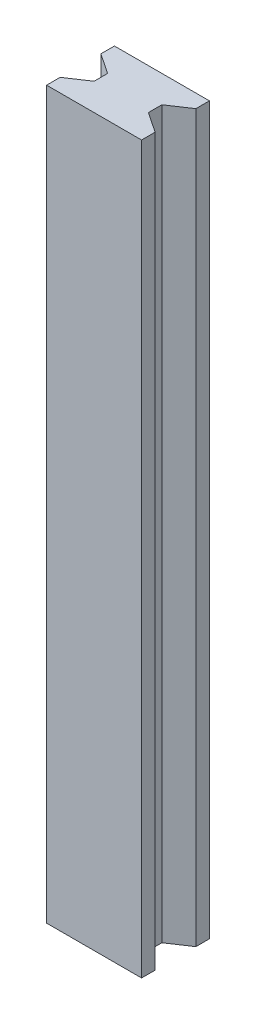
ISO-10303-21;
HEADER;
FILE_DESCRIPTION(('STEP AP214'),'2;1');
FILE_NAME('part.step','',(''),(''),'','','');
FILE_SCHEMA(('AUTOMOTIVE_DESIGN { 1 0 10303 214 1 1 1 1 }'));
ENDSEC;
DATA;
#1=APPLICATION_CONTEXT('core data for automotive mechanical design processes');
#2=APPLICATION_PROTOCOL_DEFINITION('international standard','automotive_design',2000,#1);
#3=PRODUCT_CONTEXT('',#1,'mechanical');
#4=PRODUCT('Part','Part','',(#3));
#5=PRODUCT_RELATED_PRODUCT_CATEGORY('part','',(#4));
#6=PRODUCT_DEFINITION_FORMATION('','',#4);
#7=PRODUCT_DEFINITION_CONTEXT('part definition',#1,'design');
#8=PRODUCT_DEFINITION('design','',#6,#7);
#9=PRODUCT_DEFINITION_SHAPE('','',#8);
#10=(LENGTH_UNIT() NAMED_UNIT(*) SI_UNIT(.MILLI.,.METRE.));
#11=(NAMED_UNIT(*) PLANE_ANGLE_UNIT() SI_UNIT($,.RADIAN.));
#12=(NAMED_UNIT(*) SI_UNIT($,.STERADIAN.) SOLID_ANGLE_UNIT());
#13=UNCERTAINTY_MEASURE_WITH_UNIT(LENGTH_MEASURE(1.E-05),#10,'distance_accuracy_value','');
#14=(GEOMETRIC_REPRESENTATION_CONTEXT(3) GLOBAL_UNCERTAINTY_ASSIGNED_CONTEXT((#13)) GLOBAL_UNIT_ASSIGNED_CONTEXT((#10,
#11,#12)) REPRESENTATION_CONTEXT('',''));
#15=CARTESIAN_POINT('',(0.,0.,0.));
#16=DIRECTION('',(0.,0.,1.));
#17=DIRECTION('',(1.,0.,0.));
#18=AXIS2_PLACEMENT_3D('',#15,#16,#17);
#19=CARTESIAN_POINT('',(3.84615384615076,535.,5.76923076922906));
#20=DIRECTION('',(0.554700196225035,0.,0.832050294337973));
#21=DIRECTION('',(0.832050294337973,0.,-0.554700196225035));
#22=AXIS2_PLACEMENT_3D('',#19,#20,#21);
#23=PLANE('',#22);
#24=DIRECTION('',(-0.832050294337973,0.,0.554700196225035));
#25=VECTOR('',#24,1.);
#26=CARTESIAN_POINT('',(3.84615384615076,0.,5.76923076922906));
#27=LINE('',#26,#25);
#28=CARTESIAN_POINT('',(35.,0.,-14.9999999999933));
#29=VERTEX_POINT('',#28);
#30=CARTESIAN_POINT('',(20.0000000000023,0.,-4.99999999999986));
#31=VERTEX_POINT('',#30);
#32=EDGE_CURVE('E157',#29,#31,#27,.T.);
#33=ORIENTED_EDGE('',*,*,#32,.F.);
#34=DIRECTION('',(0.,-1.,0.));
#35=VECTOR('',#34,1.);
#36=CARTESIAN_POINT('',(35.,535.,-14.9999999999933));
#37=LINE('',#36,#35);
#38=CARTESIAN_POINT('',(35.,535.,-14.9999999999933));
#39=VERTEX_POINT('',#38);
#40=EDGE_CURVE('E11',#39,#29,#37,.T.);
#41=ORIENTED_EDGE('',*,*,#40,.F.);
#42=DIRECTION('',(-0.832050294337973,0.,0.554700196225035));
#43=VECTOR('',#42,1.);
#44=CARTESIAN_POINT('',(3.84615384615076,535.,5.76923076922906));
#45=LINE('',#44,#43);
#46=CARTESIAN_POINT('',(20.0000000000023,535.,-4.99999999999986));
#47=VERTEX_POINT('',#46);
#48=EDGE_CURVE('E185',#39,#47,#45,.T.);
#49=ORIENTED_EDGE('',*,*,#48,.T.);
#50=DIRECTION('',(0.,-1.,0.));
#51=VECTOR('',#50,1.);
#52=CARTESIAN_POINT('',(20.0000000000023,535.,-4.99999999999986));
#53=LINE('',#52,#51);
#54=EDGE_CURVE('E52',#47,#31,#53,.T.);
#55=ORIENTED_EDGE('',*,*,#54,.T.);
#56=EDGE_LOOP('',(#33,#41,#49,#55));
#57=FACE_BOUND('',#56,.T.);
#58=ADVANCED_FACE('F36',(#57),#23,.T.);
#59=CARTESIAN_POINT('',(35.,535.,0.));
#60=DIRECTION('',(-1.,0.,0.));
#61=DIRECTION('',(0.,0.,1.));
#62=AXIS2_PLACEMENT_3D('',#59,#60,#61);
#63=PLANE('',#62);
#64=DIRECTION('',(0.,0.,-1.));
#65=VECTOR('',#64,1.);
#66=CARTESIAN_POINT('',(35.,0.,0.));
#67=LINE('',#66,#65);
#68=CARTESIAN_POINT('',(35.,0.,-25.));
#69=VERTEX_POINT('',#68);
#70=EDGE_CURVE('E159',#29,#69,#67,.T.);
#71=ORIENTED_EDGE('',*,*,#70,.T.);
#72=DIRECTION('',(0.,-1.,0.));
#73=VECTOR('',#72,1.);
#74=CARTESIAN_POINT('',(35.,535.,-25.));
#75=LINE('',#74,#73);
#76=CARTESIAN_POINT('',(35.,535.,-25.));
#77=VERTEX_POINT('',#76);
#78=EDGE_CURVE('E44',#77,#69,#75,.T.);
#79=ORIENTED_EDGE('',*,*,#78,.F.);
#80=DIRECTION('',(0.,0.,-1.));
#81=VECTOR('',#80,1.);
#82=CARTESIAN_POINT('',(35.,535.,0.));
#83=LINE('',#82,#81);
#84=EDGE_CURVE('E140',#39,#77,#83,.T.);
#85=ORIENTED_EDGE('',*,*,#84,.F.);
#86=ORIENTED_EDGE('',*,*,#40,.T.);
#87=EDGE_LOOP('',(#71,#79,#85,#86));
#88=FACE_BOUND('',#87,.T.);
#89=ADVANCED_FACE('F209',(#88),#63,.F.);
#90=CARTESIAN_POINT('',(0.,535.,-25.));
#91=DIRECTION('',(0.,0.,-1.));
#92=DIRECTION('',(-1.,0.,0.));
#93=AXIS2_PLACEMENT_3D('',#90,#91,#92);
#94=PLANE('',#93);
#95=DIRECTION('',(1.,0.,0.));
#96=VECTOR('',#95,1.);
#97=CARTESIAN_POINT('',(0.,0.,-25.));
#98=LINE('',#97,#96);
#99=CARTESIAN_POINT('',(-35.,0.,-25.));
#100=VERTEX_POINT('',#99);
#101=EDGE_CURVE('E162',#100,#69,#98,.T.);
#102=ORIENTED_EDGE('',*,*,#101,.F.);
#103=DIRECTION('',(0.,-1.,0.));
#104=VECTOR('',#103,1.);
#105=CARTESIAN_POINT('',(-35.,535.,-25.));
#106=LINE('',#105,#104);
#107=CARTESIAN_POINT('',(-35.,535.,-25.));
#108=VERTEX_POINT('',#107);
#109=EDGE_CURVE('E199',#108,#100,#106,.T.);
#110=ORIENTED_EDGE('',*,*,#109,.F.);
#111=DIRECTION('',(1.,0.,0.));
#112=VECTOR('',#111,1.);
#113=CARTESIAN_POINT('',(0.,535.,-25.));
#114=LINE('',#113,#112);
#115=EDGE_CURVE('E206',#108,#77,#114,.T.);
#116=ORIENTED_EDGE('',*,*,#115,.T.);
#117=ORIENTED_EDGE('',*,*,#78,.T.);
#118=EDGE_LOOP('',(#102,#110,#116,#117));
#119=FACE_BOUND('',#118,.T.);
#120=ADVANCED_FACE('F204',(#119),#94,.T.);
#121=CARTESIAN_POINT('',(-35.,535.,0.));
#122=DIRECTION('',(-1.,0.,0.));
#123=DIRECTION('',(0.,0.,1.));
#124=AXIS2_PLACEMENT_3D('',#121,#122,#123);
#125=PLANE('',#124);
#126=DIRECTION('',(0.,0.,-1.));
#127=VECTOR('',#126,1.);
#128=CARTESIAN_POINT('',(-35.,0.,0.));
#129=LINE('',#128,#127);
#130=CARTESIAN_POINT('',(-35.,0.,-15.));
#131=VERTEX_POINT('',#130);
#132=EDGE_CURVE('E165',#131,#100,#129,.T.);
#133=ORIENTED_EDGE('',*,*,#132,.F.);
#134=DIRECTION('',(0.,-1.,0.));
#135=VECTOR('',#134,1.);
#136=CARTESIAN_POINT('',(-35.,535.,-15.));
#137=LINE('',#136,#135);
#138=CARTESIAN_POINT('',(-35.,535.,-15.));
#139=VERTEX_POINT('',#138);
#140=EDGE_CURVE('E197',#139,#131,#137,.T.);
#141=ORIENTED_EDGE('',*,*,#140,.F.);
#142=DIRECTION('',(0.,0.,-1.));
#143=VECTOR('',#142,1.);
#144=CARTESIAN_POINT('',(-35.,535.,0.));
#145=LINE('',#144,#143);
#146=EDGE_CURVE('E218',#139,#108,#145,.T.);
#147=ORIENTED_EDGE('',*,*,#146,.T.);
#148=ORIENTED_EDGE('',*,*,#109,.T.);
#149=EDGE_LOOP('',(#133,#141,#147,#148));
#150=FACE_BOUND('',#149,.T.);
#151=ADVANCED_FACE('F215',(#150),#125,.T.);
#152=CARTESIAN_POINT('',(-3.84615384615385,535.,5.76923076923077));
#153=DIRECTION('',(-0.554700196225229,0.,0.832050294337844));
#154=DIRECTION('',(0.832050294337844,0.,0.554700196225229));
#155=AXIS2_PLACEMENT_3D('',#152,#153,#154);
#156=PLANE('',#155);
#157=DIRECTION('',(-0.832050294337844,0.,-0.554700196225229));
#158=VECTOR('',#157,1.);
#159=CARTESIAN_POINT('',(-3.84615384615385,0.,5.76923076923077));
#160=LINE('',#159,#158);
#161=CARTESIAN_POINT('',(-20.,0.,-5.));
#162=VERTEX_POINT('',#161);
#163=EDGE_CURVE('E168',#162,#131,#160,.T.);
#164=ORIENTED_EDGE('',*,*,#163,.F.);
#165=DIRECTION('',(0.,-1.,0.));
#166=VECTOR('',#165,1.);
#167=CARTESIAN_POINT('',(-20.,535.,-5.));
#168=LINE('',#167,#166);
#169=CARTESIAN_POINT('',(-20.,535.,-5.));
#170=VERTEX_POINT('',#169);
#171=EDGE_CURVE('E195',#170,#162,#168,.T.);
#172=ORIENTED_EDGE('',*,*,#171,.F.);
#173=DIRECTION('',(-0.832050294337844,0.,-0.554700196225229));
#174=VECTOR('',#173,1.);
#175=CARTESIAN_POINT('',(-3.84615384615385,535.,5.76923076923077));
#176=LINE('',#175,#174);
#177=EDGE_CURVE('E222',#170,#139,#176,.T.);
#178=ORIENTED_EDGE('',*,*,#177,.T.);
#179=ORIENTED_EDGE('',*,*,#140,.T.);
#180=EDGE_LOOP('',(#164,#172,#178,#179));
#181=FACE_BOUND('',#180,.T.);
#182=ADVANCED_FACE('F320',(#181),#156,.T.);
#183=CARTESIAN_POINT('',(-20.,535.,0.));
#184=DIRECTION('',(-1.,0.,0.));
#185=DIRECTION('',(0.,0.,1.));
#186=AXIS2_PLACEMENT_3D('',#183,#184,#185);
#187=PLANE('',#186);
#188=DIRECTION('',(0.,0.,-1.));
#189=VECTOR('',#188,1.);
#190=CARTESIAN_POINT('',(-20.,0.,0.));
#191=LINE('',#190,#189);
#192=CARTESIAN_POINT('',(-20.,0.,5.));
#193=VERTEX_POINT('',#192);
#194=EDGE_CURVE('E172',#193,#162,#191,.T.);
#195=ORIENTED_EDGE('',*,*,#194,.F.);
#196=DIRECTION('',(0.,-1.,0.));
#197=VECTOR('',#196,1.);
#198=CARTESIAN_POINT('',(-20.,535.,5.));
#199=LINE('',#198,#197);
#200=CARTESIAN_POINT('',(-20.,535.,5.));
#201=VERTEX_POINT('',#200);
#202=EDGE_CURVE('E193',#201,#193,#199,.T.);
#203=ORIENTED_EDGE('',*,*,#202,.F.);
#204=DIRECTION('',(0.,0.,-1.));
#205=VECTOR('',#204,1.);
#206=CARTESIAN_POINT('',(-20.,535.,0.));
#207=LINE('',#206,#205);
#208=EDGE_CURVE('E228',#201,#170,#207,.T.);
#209=ORIENTED_EDGE('',*,*,#208,.T.);
#210=ORIENTED_EDGE('',*,*,#171,.T.);
#211=EDGE_LOOP('',(#195,#203,#209,#210));
#212=FACE_BOUND('',#211,.T.);
#213=ADVANCED_FACE('F242',(#212),#187,.T.);
#214=CARTESIAN_POINT('',(-3.84615384615385,535.,-5.76923076923077));
#215=DIRECTION('',(-0.554700196225229,0.,-0.832050294337844));
#216=DIRECTION('',(-0.832050294337844,0.,0.554700196225229));
#217=AXIS2_PLACEMENT_3D('',#214,#215,#216);
#218=PLANE('',#217);
#219=DIRECTION('',(0.832050294337844,0.,-0.554700196225229));
#220=VECTOR('',#219,1.);
#221=CARTESIAN_POINT('',(-3.84615384615385,0.,-5.76923076923077));
#222=LINE('',#221,#220);
#223=CARTESIAN_POINT('',(-35.,0.,15.));
#224=VERTEX_POINT('',#223);
#225=EDGE_CURVE('E175',#224,#193,#222,.T.);
#226=ORIENTED_EDGE('',*,*,#225,.F.);
#227=DIRECTION('',(0.,-1.,0.));
#228=VECTOR('',#227,1.);
#229=CARTESIAN_POINT('',(-35.,535.,15.));
#230=LINE('',#229,#228);
#231=CARTESIAN_POINT('',(-35.,535.,15.));
#232=VERTEX_POINT('',#231);
#233=EDGE_CURVE('E191',#232,#224,#230,.T.);
#234=ORIENTED_EDGE('',*,*,#233,.F.);
#235=DIRECTION('',(0.832050294337844,0.,-0.554700196225229));
#236=VECTOR('',#235,1.);
#237=CARTESIAN_POINT('',(-3.84615384615385,535.,-5.76923076923077));
#238=LINE('',#237,#236);
#239=EDGE_CURVE('E230',#232,#201,#238,.T.);
#240=ORIENTED_EDGE('',*,*,#239,.T.);
#241=ORIENTED_EDGE('',*,*,#202,.T.);
#242=EDGE_LOOP('',(#226,#234,#240,#241));
#243=FACE_BOUND('',#242,.T.);
#244=ADVANCED_FACE('F243',(#243),#218,.T.);
#245=CARTESIAN_POINT('',(-35.,0.,25.));
#246=VERTEX_POINT('',#245);
#247=EDGE_CURVE('E169',#246,#224,#129,.T.);
#248=ORIENTED_EDGE('',*,*,#247,.F.);
#249=DIRECTION('',(0.,-1.,0.));
#250=VECTOR('',#249,1.);
#251=CARTESIAN_POINT('',(-35.,535.,25.));
#252=LINE('',#251,#250);
#253=CARTESIAN_POINT('',(-35.,535.,25.));
#254=VERTEX_POINT('',#253);
#255=EDGE_CURVE('E189',#254,#246,#252,.T.);
#256=ORIENTED_EDGE('',*,*,#255,.F.);
#257=EDGE_CURVE('E224',#254,#232,#145,.T.);
#258=ORIENTED_EDGE('',*,*,#257,.T.);
#259=ORIENTED_EDGE('',*,*,#233,.T.);
#260=EDGE_LOOP('',(#248,#256,#258,#259));
#261=FACE_BOUND('',#260,.T.);
#262=ADVANCED_FACE('F237',(#261),#125,.T.);
#263=CARTESIAN_POINT('',(0.,535.,25.));
#264=DIRECTION('',(0.,0.,-1.));
#265=DIRECTION('',(-1.,0.,0.));
#266=AXIS2_PLACEMENT_3D('',#263,#264,#265);
#267=PLANE('',#266);
#268=DIRECTION('',(1.,0.,0.));
#269=VECTOR('',#268,1.);
#270=CARTESIAN_POINT('',(0.,0.,25.));
#271=LINE('',#270,#269);
#272=CARTESIAN_POINT('',(35.,0.,25.));
#273=VERTEX_POINT('',#272);
#274=EDGE_CURVE('E178',#246,#273,#271,.T.);
#275=ORIENTED_EDGE('',*,*,#274,.T.);
#276=DIRECTION('',(0.,-1.,0.));
#277=VECTOR('',#276,1.);
#278=CARTESIAN_POINT('',(35.,535.,25.));
#279=LINE('',#278,#277);
#280=CARTESIAN_POINT('',(35.,535.,25.));
#281=VERTEX_POINT('',#280);
#282=EDGE_CURVE('E148',#281,#273,#279,.T.);
#283=ORIENTED_EDGE('',*,*,#282,.F.);
#284=DIRECTION('',(1.,0.,0.));
#285=VECTOR('',#284,1.);
#286=CARTESIAN_POINT('',(0.,535.,25.));
#287=LINE('',#286,#285);
#288=EDGE_CURVE('E135',#254,#281,#287,.T.);
#289=ORIENTED_EDGE('',*,*,#288,.F.);
#290=ORIENTED_EDGE('',*,*,#255,.T.);
#291=EDGE_LOOP('',(#275,#283,#289,#290));
#292=FACE_BOUND('',#291,.T.);
#293=ADVANCED_FACE('F247',(#292),#267,.F.);
#294=CARTESIAN_POINT('',(35.,0.,15.0000000000052));
#295=VERTEX_POINT('',#294);
#296=EDGE_CURVE('E145',#273,#295,#67,.T.);
#297=ORIENTED_EDGE('',*,*,#296,.T.);
#298=DIRECTION('',(0.,-1.,0.));
#299=VECTOR('',#298,1.);
#300=CARTESIAN_POINT('',(35.,535.,15.0000000000052));
#301=LINE('',#300,#299);
#302=CARTESIAN_POINT('',(35.,535.,15.0000000000052));
#303=VERTEX_POINT('',#302);
#304=EDGE_CURVE('E142',#303,#295,#301,.T.);
#305=ORIENTED_EDGE('',*,*,#304,.F.);
#306=EDGE_CURVE('E126',#281,#303,#83,.T.);
#307=ORIENTED_EDGE('',*,*,#306,.F.);
#308=ORIENTED_EDGE('',*,*,#282,.T.);
#309=EDGE_LOOP('',(#297,#305,#307,#308));
#310=FACE_BOUND('',#309,.T.);
#311=ADVANCED_FACE('F143',(#310),#63,.F.);
#312=CARTESIAN_POINT('',(3.84615384615763,535.,-5.76923076923353));
#313=DIRECTION('',(0.554700196225423,0.,-0.832050294337714));
#314=DIRECTION('',(-0.832050294337714,0.,-0.554700196225423));
#315=AXIS2_PLACEMENT_3D('',#312,#313,#314);
#316=PLANE('',#315);
#317=DIRECTION('',(0.832050294337714,0.,0.554700196225423));
#318=VECTOR('',#317,1.);
#319=CARTESIAN_POINT('',(3.84615384615763,0.,-5.76923076923353));
#320=LINE('',#319,#318);
#321=CARTESIAN_POINT('',(20.,0.,5.00000000000014));
#322=VERTEX_POINT('',#321);
#323=EDGE_CURVE('E180',#322,#295,#320,.T.);
#324=ORIENTED_EDGE('',*,*,#323,.F.);
#325=DIRECTION('',(0.,-1.,0.));
#326=VECTOR('',#325,1.);
#327=CARTESIAN_POINT('',(20.,535.,5.00000000000014));
#328=LINE('',#327,#326);
#329=CARTESIAN_POINT('',(20.,535.,5.00000000000014));
#330=VERTEX_POINT('',#329);
#331=EDGE_CURVE('E89',#330,#322,#328,.T.);
#332=ORIENTED_EDGE('',*,*,#331,.F.);
#333=DIRECTION('',(0.832050294337714,0.,0.554700196225423));
#334=VECTOR('',#333,1.);
#335=CARTESIAN_POINT('',(3.84615384615763,535.,-5.76923076923353));
#336=LINE('',#335,#334);
#337=EDGE_CURVE('E132',#330,#303,#336,.T.);
#338=ORIENTED_EDGE('',*,*,#337,.T.);
#339=ORIENTED_EDGE('',*,*,#304,.T.);
#340=EDGE_LOOP('',(#324,#332,#338,#339));
#341=FACE_BOUND('',#340,.T.);
#342=ADVANCED_FACE('F150',(#341),#316,.T.);
#343=CARTESIAN_POINT('',(20.0000000000011,535.,4.68375338513765E-12));
#344=DIRECTION('',(1.,0.,2.34187669256869E-13));
#345=DIRECTION('',(2.34187669256869E-13,0.,-1.));
#346=AXIS2_PLACEMENT_3D('',#343,#344,#345);
#347=PLANE('',#346);
#348=DIRECTION('',(-2.34187669256869E-13,0.,1.));
#349=VECTOR('',#348,1.);
#350=CARTESIAN_POINT('',(20.0000000000011,0.,4.68375338513765E-12));
#351=LINE('',#350,#349);
#352=EDGE_CURVE('E182',#31,#322,#351,.T.);
#353=ORIENTED_EDGE('',*,*,#352,.F.);
#354=ORIENTED_EDGE('',*,*,#54,.F.);
#355=DIRECTION('',(-2.34187669256869E-13,0.,1.));
#356=VECTOR('',#355,1.);
#357=CARTESIAN_POINT('',(20.0000000000011,535.,4.68375338513765E-12));
#358=LINE('',#357,#356);
#359=EDGE_CURVE('E151',#47,#330,#358,.T.);
#360=ORIENTED_EDGE('',*,*,#359,.T.);
#361=ORIENTED_EDGE('',*,*,#331,.T.);
#362=EDGE_LOOP('',(#353,#354,#360,#361));
#363=FACE_BOUND('',#362,.T.);
#364=ADVANCED_FACE('F260',(#363),#347,.T.);
#365=CARTESIAN_POINT('',(0.,535.,0.));
#366=DIRECTION('',(0.,1.,0.));
#367=DIRECTION('',(0.,0.,1.));
#368=AXIS2_PLACEMENT_3D('',#365,#366,#367);
#369=PLANE('',#368);
#370=ORIENTED_EDGE('',*,*,#48,.F.);
#371=ORIENTED_EDGE('',*,*,#84,.T.);
#372=ORIENTED_EDGE('',*,*,#115,.F.);
#373=ORIENTED_EDGE('',*,*,#146,.F.);
#374=ORIENTED_EDGE('',*,*,#177,.F.);
#375=ORIENTED_EDGE('',*,*,#208,.F.);
#376=ORIENTED_EDGE('',*,*,#239,.F.);
#377=ORIENTED_EDGE('',*,*,#257,.F.);
#378=ORIENTED_EDGE('',*,*,#288,.T.);
#379=ORIENTED_EDGE('',*,*,#306,.T.);
#380=ORIENTED_EDGE('',*,*,#337,.F.);
#381=ORIENTED_EDGE('',*,*,#359,.F.);
#382=EDGE_LOOP('',(#370,#371,#372,#373,#374,#375,#376,#377,#378,#379,#380,#381));
#383=FACE_BOUND('',#382,.T.);
#384=ADVANCED_FACE('F129',(#383),#369,.T.);
#385=CARTESIAN_POINT('',(0.,0.,0.));
#386=DIRECTION('',(0.,1.,0.));
#387=DIRECTION('',(0.,0.,1.));
#388=AXIS2_PLACEMENT_3D('',#385,#386,#387);
#389=PLANE('',#388);
#390=ORIENTED_EDGE('',*,*,#32,.T.);
#391=ORIENTED_EDGE('',*,*,#352,.T.);
#392=ORIENTED_EDGE('',*,*,#323,.T.);
#393=ORIENTED_EDGE('',*,*,#296,.F.);
#394=ORIENTED_EDGE('',*,*,#274,.F.);
#395=ORIENTED_EDGE('',*,*,#247,.T.);
#396=ORIENTED_EDGE('',*,*,#225,.T.);
#397=ORIENTED_EDGE('',*,*,#194,.T.);
#398=ORIENTED_EDGE('',*,*,#163,.T.);
#399=ORIENTED_EDGE('',*,*,#132,.T.);
#400=ORIENTED_EDGE('',*,*,#101,.T.);
#401=ORIENTED_EDGE('',*,*,#70,.F.);
#402=EDGE_LOOP('',(#390,#391,#392,#393,#394,#395,#396,#397,#398,#399,#400,#401));
#403=FACE_BOUND('',#402,.T.);
#404=ADVANCED_FACE('F211',(#403),#389,.F.);
#405=CLOSED_SHELL('',(#58,#89,#120,#151,#182,#213,#244,#262,#293,#311,#342,#364,#384,#404));
#406=MANIFOLD_SOLID_BREP('B2',#405);
#407=ADVANCED_BREP_SHAPE_REPRESENTATION('',(#18,#406),#14);
#408=SHAPE_DEFINITION_REPRESENTATION(#9,#407);
ENDSEC;
END-ISO-10303-21;
